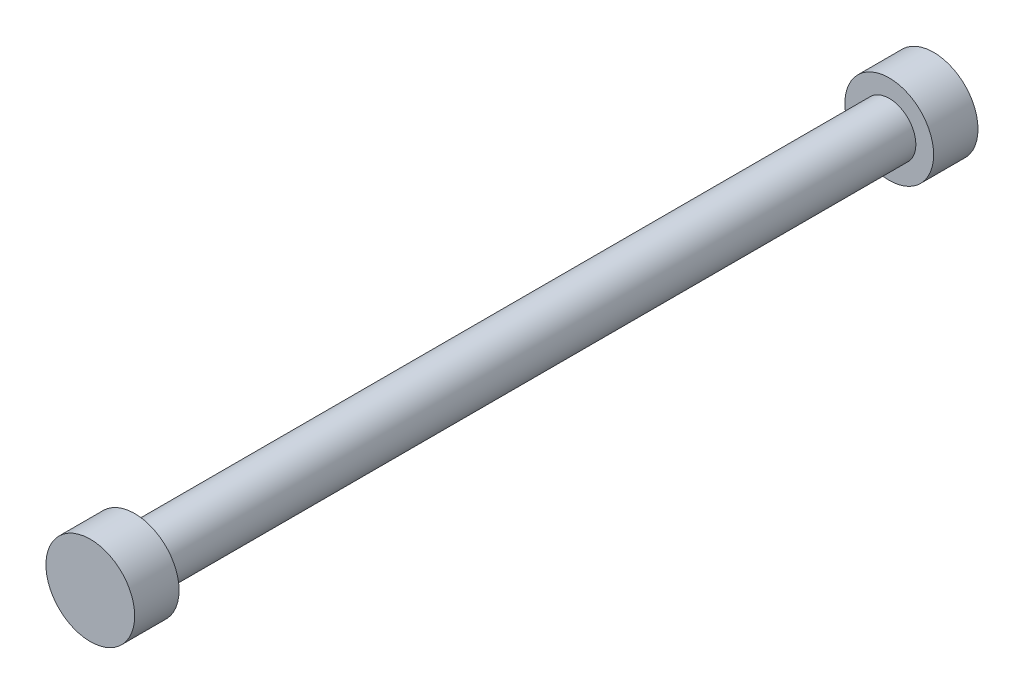
ISO-10303-21;
HEADER;
FILE_DESCRIPTION(('STEP AP214'),'2;1');
FILE_NAME('part.step','',(''),(''),'','','');
FILE_SCHEMA(('AUTOMOTIVE_DESIGN { 1 0 10303 214 1 1 1 1 }'));
ENDSEC;
DATA;
#1=APPLICATION_CONTEXT('core data for automotive mechanical design processes');
#2=APPLICATION_PROTOCOL_DEFINITION('international standard','automotive_design',2000,#1);
#3=PRODUCT_CONTEXT('',#1,'mechanical');
#4=PRODUCT('Part','Part','',(#3));
#5=PRODUCT_RELATED_PRODUCT_CATEGORY('part','',(#4));
#6=PRODUCT_DEFINITION_FORMATION('','',#4);
#7=PRODUCT_DEFINITION_CONTEXT('part definition',#1,'design');
#8=PRODUCT_DEFINITION('design','',#6,#7);
#9=PRODUCT_DEFINITION_SHAPE('','',#8);
#10=(LENGTH_UNIT() NAMED_UNIT(*) SI_UNIT(.MILLI.,.METRE.));
#11=(NAMED_UNIT(*) PLANE_ANGLE_UNIT() SI_UNIT($,.RADIAN.));
#12=(NAMED_UNIT(*) SI_UNIT($,.STERADIAN.) SOLID_ANGLE_UNIT());
#13=UNCERTAINTY_MEASURE_WITH_UNIT(LENGTH_MEASURE(1.E-05),#10,'distance_accuracy_value','');
#14=(GEOMETRIC_REPRESENTATION_CONTEXT(3) GLOBAL_UNCERTAINTY_ASSIGNED_CONTEXT((#13)) GLOBAL_UNIT_ASSIGNED_CONTEXT((#10,
#11,#12)) REPRESENTATION_CONTEXT('',''));
#15=CARTESIAN_POINT('',(0.,0.,0.));
#16=DIRECTION('',(0.,0.,1.));
#17=DIRECTION('',(1.,0.,0.));
#18=AXIS2_PLACEMENT_3D('',#15,#16,#17);
#19=CARTESIAN_POINT('',(0.,0.,42.5));
#20=DIRECTION('',(0.,0.,-1.));
#21=DIRECTION('',(-1.,0.,0.));
#22=AXIS2_PLACEMENT_3D('',#19,#20,#21);
#23=CYLINDRICAL_SURFACE('',#22,3.);
#24=CARTESIAN_POINT('',(0.,0.,42.5));
#25=DIRECTION('',(0.,0.,1.));
#26=DIRECTION('',(1.,0.,0.));
#27=AXIS2_PLACEMENT_3D('',#24,#25,#26);
#28=CIRCLE('',#27,3.);
#29=CARTESIAN_POINT('',(3.,0.,42.5));
#30=VERTEX_POINT('',#29);
#31=EDGE_CURVE('E10',#30,#30,#28,.T.);
#32=ORIENTED_EDGE('',*,*,#31,.F.);
#33=EDGE_LOOP('',(#32));
#34=FACE_BOUND('',#33,.T.);
#35=CARTESIAN_POINT('',(0.,0.,-42.5));
#36=DIRECTION('',(0.,0.,1.));
#37=DIRECTION('',(1.,0.,0.));
#38=AXIS2_PLACEMENT_3D('',#35,#36,#37);
#39=CIRCLE('',#38,3.);
#40=CARTESIAN_POINT('',(3.,0.,-42.5));
#41=VERTEX_POINT('',#40);
#42=EDGE_CURVE('E44',#41,#41,#39,.T.);
#43=ORIENTED_EDGE('',*,*,#42,.T.);
#44=EDGE_LOOP('',(#43));
#45=FACE_BOUND('',#44,.T.);
#46=ADVANCED_FACE('F41',(#34,#45),#23,.T.);
#47=CARTESIAN_POINT('',(0.,0.,47.5));
#48=DIRECTION('',(0.,0.,-1.));
#49=DIRECTION('',(-1.,0.,0.));
#50=AXIS2_PLACEMENT_3D('',#47,#48,#49);
#51=CYLINDRICAL_SURFACE('',#50,5.);
#52=CARTESIAN_POINT('',(0.,0.,47.5));
#53=DIRECTION('',(0.,0.,1.));
#54=DIRECTION('',(1.,0.,0.));
#55=AXIS2_PLACEMENT_3D('',#52,#53,#54);
#56=CIRCLE('',#55,5.);
#57=CARTESIAN_POINT('',(5.,0.,47.5));
#58=VERTEX_POINT('',#57);
#59=EDGE_CURVE('E49',#58,#58,#56,.T.);
#60=ORIENTED_EDGE('',*,*,#59,.F.);
#61=EDGE_LOOP('',(#60));
#62=FACE_BOUND('',#61,.T.);
#63=CARTESIAN_POINT('',(0.,0.,42.5));
#64=DIRECTION('',(0.,0.,1.));
#65=DIRECTION('',(1.,0.,0.));
#66=AXIS2_PLACEMENT_3D('',#63,#64,#65);
#67=CIRCLE('',#66,5.);
#68=CARTESIAN_POINT('',(5.,0.,42.5));
#69=VERTEX_POINT('',#68);
#70=EDGE_CURVE('E54',#69,#69,#67,.T.);
#71=ORIENTED_EDGE('',*,*,#70,.T.);
#72=EDGE_LOOP('',(#71));
#73=FACE_BOUND('',#72,.T.);
#74=ADVANCED_FACE('F95',(#62,#73),#51,.T.);
#75=CARTESIAN_POINT('',(0.,0.,47.5));
#76=DIRECTION('',(0.,0.,1.));
#77=DIRECTION('',(1.,0.,0.));
#78=AXIS2_PLACEMENT_3D('',#75,#76,#77);
#79=PLANE('',#78);
#80=ORIENTED_EDGE('',*,*,#59,.T.);
#81=EDGE_LOOP('',(#80));
#82=FACE_BOUND('',#81,.T.);
#83=ADVANCED_FACE('F91',(#82),#79,.T.);
#84=CARTESIAN_POINT('',(0.,0.,42.5));
#85=DIRECTION('',(0.,0.,1.));
#86=DIRECTION('',(1.,0.,0.));
#87=AXIS2_PLACEMENT_3D('',#84,#85,#86);
#88=PLANE('',#87);
#89=ORIENTED_EDGE('',*,*,#31,.T.);
#90=EDGE_LOOP('',(#89));
#91=FACE_BOUND('',#90,.T.);
#92=ORIENTED_EDGE('',*,*,#70,.F.);
#93=EDGE_LOOP('',(#92));
#94=FACE_BOUND('',#93,.T.);
#95=ADVANCED_FACE('F83',(#91,#94),#88,.F.);
#96=CARTESIAN_POINT('',(0.,0.,-47.5));
#97=DIRECTION('',(0.,0.,1.));
#98=DIRECTION('',(1.,0.,0.));
#99=AXIS2_PLACEMENT_3D('',#96,#97,#98);
#100=CYLINDRICAL_SURFACE('',#99,5.);
#101=CARTESIAN_POINT('',(0.,0.,-47.5));
#102=DIRECTION('',(0.,0.,1.));
#103=DIRECTION('',(1.,0.,0.));
#104=AXIS2_PLACEMENT_3D('',#101,#102,#103);
#105=CIRCLE('',#104,5.);
#106=CARTESIAN_POINT('',(5.,0.,-47.5));
#107=VERTEX_POINT('',#106);
#108=EDGE_CURVE('E64',#107,#107,#105,.T.);
#109=ORIENTED_EDGE('',*,*,#108,.T.);
#110=EDGE_LOOP('',(#109));
#111=FACE_BOUND('',#110,.T.);
#112=CARTESIAN_POINT('',(0.,0.,-42.5));
#113=DIRECTION('',(0.,0.,1.));
#114=DIRECTION('',(1.,0.,0.));
#115=AXIS2_PLACEMENT_3D('',#112,#113,#114);
#116=CIRCLE('',#115,5.);
#117=CARTESIAN_POINT('',(5.,0.,-42.5));
#118=VERTEX_POINT('',#117);
#119=EDGE_CURVE('E60',#118,#118,#116,.T.);
#120=ORIENTED_EDGE('',*,*,#119,.F.);
#121=EDGE_LOOP('',(#120));
#122=FACE_BOUND('',#121,.T.);
#123=ADVANCED_FACE('F81',(#111,#122),#100,.T.);
#124=CARTESIAN_POINT('',(0.,0.,-47.5));
#125=DIRECTION('',(0.,0.,-1.));
#126=DIRECTION('',(1.,0.,0.));
#127=AXIS2_PLACEMENT_3D('',#124,#125,#126);
#128=PLANE('',#127);
#129=ORIENTED_EDGE('',*,*,#108,.F.);
#130=EDGE_LOOP('',(#129));
#131=FACE_BOUND('',#130,.T.);
#132=ADVANCED_FACE('F77',(#131),#128,.T.);
#133=CARTESIAN_POINT('',(0.,0.,-42.5));
#134=DIRECTION('',(0.,0.,-1.));
#135=DIRECTION('',(1.,0.,0.));
#136=AXIS2_PLACEMENT_3D('',#133,#134,#135);
#137=PLANE('',#136);
#138=ORIENTED_EDGE('',*,*,#42,.F.);
#139=EDGE_LOOP('',(#138));
#140=FACE_BOUND('',#139,.T.);
#141=ORIENTED_EDGE('',*,*,#119,.T.);
#142=EDGE_LOOP('',(#141));
#143=FACE_BOUND('',#142,.T.);
#144=ADVANCED_FACE('F74',(#140,#143),#137,.F.);
#145=CLOSED_SHELL('',(#46,#74,#83,#95,#123,#132,#144));
#146=MANIFOLD_SOLID_BREP('B2',#145);
#147=ADVANCED_BREP_SHAPE_REPRESENTATION('',(#18,#146),#14);
#148=SHAPE_DEFINITION_REPRESENTATION(#9,#147);
ENDSEC;
END-ISO-10303-21;
